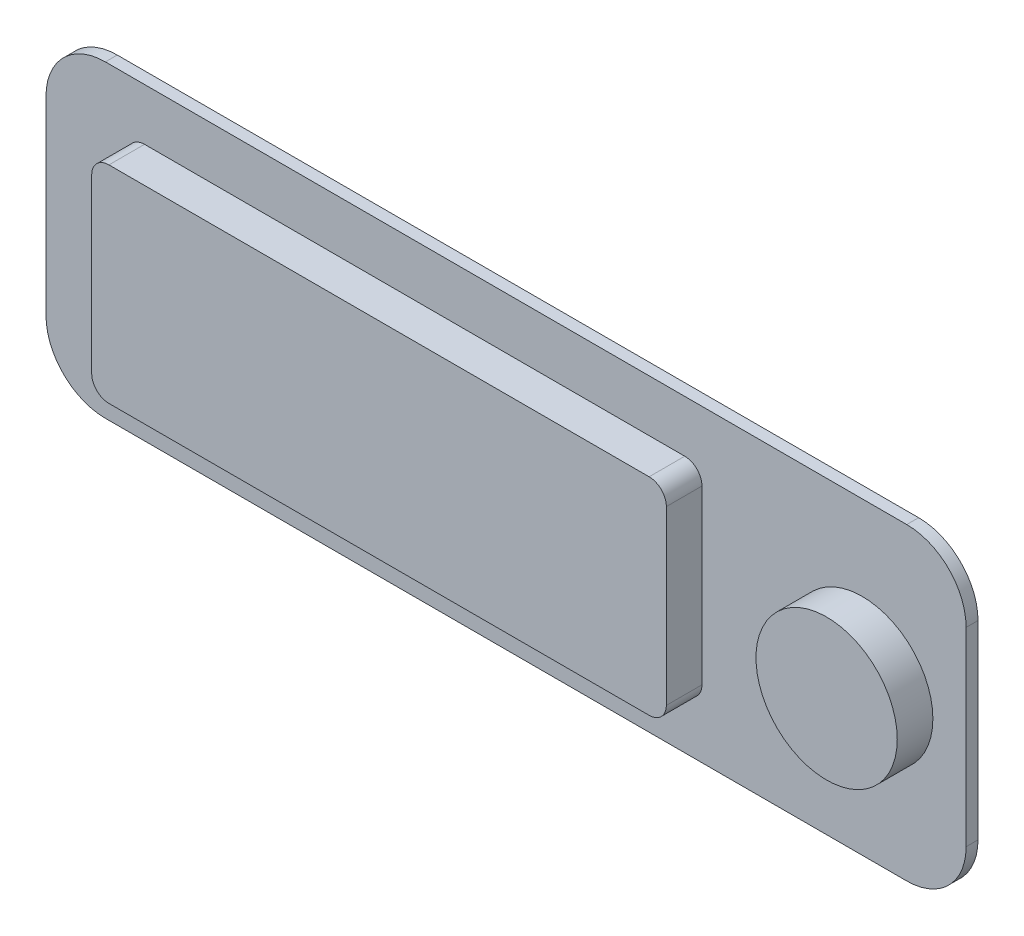
ISO-10303-21;
HEADER;
FILE_DESCRIPTION(('STEP AP214'),'2;1');
FILE_NAME('part.step','',(''),(''),'','','');
FILE_SCHEMA(('AUTOMOTIVE_DESIGN { 1 0 10303 214 1 1 1 1 }'));
ENDSEC;
DATA;
#1=APPLICATION_CONTEXT('core data for automotive mechanical design processes');
#2=APPLICATION_PROTOCOL_DEFINITION('international standard','automotive_design',2000,#1);
#3=PRODUCT_CONTEXT('',#1,'mechanical');
#4=PRODUCT('Part','Part','',(#3));
#5=PRODUCT_RELATED_PRODUCT_CATEGORY('part','',(#4));
#6=PRODUCT_DEFINITION_FORMATION('','',#4);
#7=PRODUCT_DEFINITION_CONTEXT('part definition',#1,'design');
#8=PRODUCT_DEFINITION('design','',#6,#7);
#9=PRODUCT_DEFINITION_SHAPE('','',#8);
#10=(LENGTH_UNIT() NAMED_UNIT(*) SI_UNIT(.MILLI.,.METRE.));
#11=(NAMED_UNIT(*) PLANE_ANGLE_UNIT() SI_UNIT($,.RADIAN.));
#12=(NAMED_UNIT(*) SI_UNIT($,.STERADIAN.) SOLID_ANGLE_UNIT());
#13=UNCERTAINTY_MEASURE_WITH_UNIT(LENGTH_MEASURE(1.E-05),#10,'distance_accuracy_value','');
#14=(GEOMETRIC_REPRESENTATION_CONTEXT(3) GLOBAL_UNCERTAINTY_ASSIGNED_CONTEXT((#13)) GLOBAL_UNIT_ASSIGNED_CONTEXT((#10,
#11,#12)) REPRESENTATION_CONTEXT('',''));
#15=CARTESIAN_POINT('',(0.,0.,0.));
#16=DIRECTION('',(0.,0.,1.));
#17=DIRECTION('',(1.,0.,0.));
#18=AXIS2_PLACEMENT_3D('',#15,#16,#17);
#19=CARTESIAN_POINT('',(0.,0.,2.));
#20=DIRECTION('',(0.,0.,1.));
#21=DIRECTION('',(1.,0.,0.));
#22=AXIS2_PLACEMENT_3D('',#19,#20,#21);
#23=PLANE('',#22);
#24=CARTESIAN_POINT('',(89.4228627528123,9.37536879548485,2.));
#25=DIRECTION('',(0.,0.,1.));
#26=DIRECTION('',(1.,0.,0.));
#27=AXIS2_PLACEMENT_3D('',#24,#25,#26);
#28=CIRCLE('',#27,11.9);
#29=CARTESIAN_POINT('',(101.322862752812,9.37536879548485,2.));
#30=VERTEX_POINT('',#29);
#31=EDGE_CURVE('E172',#30,#30,#28,.T.);
#32=ORIENTED_EDGE('',*,*,#31,.F.);
#33=EDGE_LOOP('',(#32));
#34=FACE_BOUND('',#33,.T.);
#35=DIRECTION('',(0.,-1.,0.));
#36=VECTOR('',#35,1.);
#37=CARTESIAN_POINT('',(-48.0771372471877,35.5051495016611,2.));
#38=LINE('',#37,#36);
#39=CARTESIAN_POINT('',(-48.0771372471877,25.5051495016611,2.));
#40=VERTEX_POINT('',#39);
#41=CARTESIAN_POINT('',(-48.0771372471877,-6.49485049833886,2.));
#42=VERTEX_POINT('',#41);
#43=EDGE_CURVE('E184',#40,#42,#38,.T.);
#44=ORIENTED_EDGE('',*,*,#43,.T.);
#45=CARTESIAN_POINT('',(-38.0771372471877,-6.49485049833887,2.));
#46=DIRECTION('',(0.,0.,1.));
#47=DIRECTION('',(1.,0.,0.));
#48=AXIS2_PLACEMENT_3D('',#45,#46,#47);
#49=CIRCLE('',#48,10.);
#50=CARTESIAN_POINT('',(-38.0771372471877,-16.4948504983389,2.));
#51=VERTEX_POINT('',#50);
#52=EDGE_CURVE('E229',#42,#51,#49,.T.);
#53=ORIENTED_EDGE('',*,*,#52,.T.);
#54=DIRECTION('',(1.,0.,0.));
#55=VECTOR('',#54,1.);
#56=CARTESIAN_POINT('',(-48.0771372471877,-16.4948504983389,2.));
#57=LINE('',#56,#55);
#58=CARTESIAN_POINT('',(96.9228627528123,-16.4948504983389,2.));
#59=VERTEX_POINT('',#58);
#60=EDGE_CURVE('E187',#51,#59,#57,.T.);
#61=ORIENTED_EDGE('',*,*,#60,.T.);
#62=CARTESIAN_POINT('',(96.9228627528123,-6.49485049833887,2.));
#63=DIRECTION('',(0.,0.,1.));
#64=DIRECTION('',(1.,0.,0.));
#65=AXIS2_PLACEMENT_3D('',#62,#63,#64);
#66=CIRCLE('',#65,10.);
#67=CARTESIAN_POINT('',(106.922862752812,-6.49485049833885,2.));
#68=VERTEX_POINT('',#67);
#69=EDGE_CURVE('E227',#59,#68,#66,.T.);
#70=ORIENTED_EDGE('',*,*,#69,.T.);
#71=DIRECTION('',(0.,1.,0.));
#72=VECTOR('',#71,1.);
#73=CARTESIAN_POINT('',(106.922862752812,35.5051495016611,2.));
#74=LINE('',#73,#72);
#75=CARTESIAN_POINT('',(106.922862752812,25.5051495016611,2.));
#76=VERTEX_POINT('',#75);
#77=EDGE_CURVE('E191',#68,#76,#74,.T.);
#78=ORIENTED_EDGE('',*,*,#77,.T.);
#79=CARTESIAN_POINT('',(96.9228627528123,25.5051495016611,2.));
#80=DIRECTION('',(0.,0.,1.));
#81=DIRECTION('',(1.,0.,0.));
#82=AXIS2_PLACEMENT_3D('',#79,#80,#81);
#83=CIRCLE('',#82,10.);
#84=CARTESIAN_POINT('',(96.9228627528123,35.5051495016611,2.));
#85=VERTEX_POINT('',#84);
#86=EDGE_CURVE('E225',#76,#85,#83,.T.);
#87=ORIENTED_EDGE('',*,*,#86,.T.);
#88=DIRECTION('',(-1.,0.,0.));
#89=VECTOR('',#88,1.);
#90=CARTESIAN_POINT('',(-48.0771372471877,35.5051495016611,2.));
#91=LINE('',#90,#89);
#92=CARTESIAN_POINT('',(-38.0771372471877,35.5051495016611,2.));
#93=VERTEX_POINT('',#92);
#94=EDGE_CURVE('E194',#85,#93,#91,.T.);
#95=ORIENTED_EDGE('',*,*,#94,.T.);
#96=CARTESIAN_POINT('',(-38.0771372471877,25.5051495016611,2.));
#97=DIRECTION('',(0.,0.,1.));
#98=DIRECTION('',(1.,0.,0.));
#99=AXIS2_PLACEMENT_3D('',#96,#97,#98);
#100=CIRCLE('',#99,10.);
#101=EDGE_CURVE('E223',#93,#40,#100,.T.);
#102=ORIENTED_EDGE('',*,*,#101,.T.);
#103=EDGE_LOOP('',(#44,#53,#61,#70,#78,#87,#95,#102));
#104=FACE_BOUND('',#103,.T.);
#105=DIRECTION('',(-1.,0.,0.));
#106=VECTOR('',#105,1.);
#107=CARTESIAN_POINT('',(-31.4771372471877,26.7753687954849,2.));
#108=LINE('',#107,#106);
#109=CARTESIAN_POINT('',(59.5228627528122,26.7753687954849,2.));
#110=VERTEX_POINT('',#109);
#111=CARTESIAN_POINT('',(-31.4771372471877,26.7753687954849,2.));
#112=VERTEX_POINT('',#111);
#113=EDGE_CURVE('E449',#110,#112,#108,.T.);
#114=ORIENTED_EDGE('',*,*,#113,.F.);
#115=CARTESIAN_POINT('',(59.5228627528123,23.8753687954849,2.));
#116=DIRECTION('',(0.,0.,1.));
#117=DIRECTION('',(-1.,0.,0.));
#118=AXIS2_PLACEMENT_3D('',#115,#116,#117);
#119=CIRCLE('',#118,2.9);
#120=CARTESIAN_POINT('',(62.4228627528123,23.8753687954848,2.));
#121=VERTEX_POINT('',#120);
#122=EDGE_CURVE('E170',#121,#110,#119,.T.);
#123=ORIENTED_EDGE('',*,*,#122,.F.);
#124=DIRECTION('',(0.,1.,0.));
#125=VECTOR('',#124,1.);
#126=CARTESIAN_POINT('',(62.4228627528123,-5.12463120451512,2.));
#127=LINE('',#126,#125);
#128=CARTESIAN_POINT('',(62.4228627528123,-5.12463120451512,2.));
#129=VERTEX_POINT('',#128);
#130=EDGE_CURVE('E166',#129,#121,#127,.T.);
#131=ORIENTED_EDGE('',*,*,#130,.F.);
#132=CARTESIAN_POINT('',(59.5228627528123,-5.12463120451515,2.));
#133=DIRECTION('',(0.,0.,1.));
#134=DIRECTION('',(1.,0.,0.));
#135=AXIS2_PLACEMENT_3D('',#132,#133,#134);
#136=CIRCLE('',#135,2.9);
#137=CARTESIAN_POINT('',(59.5228627528122,-8.02463120451515,2.));
#138=VERTEX_POINT('',#137);
#139=EDGE_CURVE('E445',#138,#129,#136,.T.);
#140=ORIENTED_EDGE('',*,*,#139,.F.);
#141=DIRECTION('',(1.,0.,0.));
#142=VECTOR('',#141,1.);
#143=CARTESIAN_POINT('',(-31.4771372471877,-8.02463120451515,2.));
#144=LINE('',#143,#142);
#145=CARTESIAN_POINT('',(-31.4771372471877,-8.02463120451515,2.));
#146=VERTEX_POINT('',#145);
#147=EDGE_CURVE('E461',#146,#138,#144,.T.);
#148=ORIENTED_EDGE('',*,*,#147,.F.);
#149=CARTESIAN_POINT('',(-31.4771372471877,-5.12463120451515,2.));
#150=DIRECTION('',(0.,0.,1.));
#151=DIRECTION('',(-1.,0.,0.));
#152=AXIS2_PLACEMENT_3D('',#149,#150,#151);
#153=CIRCLE('',#152,2.9);
#154=CARTESIAN_POINT('',(-34.3771372471877,-5.12463120451512,2.));
#155=VERTEX_POINT('',#154);
#156=EDGE_CURVE('E459',#155,#146,#153,.T.);
#157=ORIENTED_EDGE('',*,*,#156,.F.);
#158=DIRECTION('',(0.,-1.,0.));
#159=VECTOR('',#158,1.);
#160=CARTESIAN_POINT('',(-34.3771372471877,-5.12463120451512,2.));
#161=LINE('',#160,#159);
#162=CARTESIAN_POINT('',(-34.3771372471877,23.8753687954848,2.));
#163=VERTEX_POINT('',#162);
#164=EDGE_CURVE('E457',#163,#155,#161,.T.);
#165=ORIENTED_EDGE('',*,*,#164,.F.);
#166=CARTESIAN_POINT('',(-31.4771372471877,23.8753687954849,2.));
#167=DIRECTION('',(0.,0.,1.));
#168=DIRECTION('',(-1.,0.,0.));
#169=AXIS2_PLACEMENT_3D('',#166,#167,#168);
#170=CIRCLE('',#169,2.9);
#171=EDGE_CURVE('E451',#112,#163,#170,.T.);
#172=ORIENTED_EDGE('',*,*,#171,.F.);
#173=EDGE_LOOP('',(#114,#123,#131,#140,#148,#157,#165,#172));
#174=FACE_BOUND('',#173,.T.);
#175=ADVANCED_FACE('F33',(#34,#104,#174),#23,.T.);
#176=CARTESIAN_POINT('',(-48.0771372471877,35.5051495016611,2.));
#177=DIRECTION('',(1.,0.,0.));
#178=DIRECTION('',(0.,1.,0.));
#179=AXIS2_PLACEMENT_3D('',#176,#177,#178);
#180=PLANE('',#179);
#181=DIRECTION('',(0.,-1.,0.));
#182=VECTOR('',#181,1.);
#183=CARTESIAN_POINT('',(-48.0771372471877,35.5051495016611,0.));
#184=LINE('',#183,#182);
#185=CARTESIAN_POINT('',(-48.0771372471877,25.5051495016611,0.));
#186=VERTEX_POINT('',#185);
#187=CARTESIAN_POINT('',(-48.0771372471877,-6.49485049833886,0.));
#188=VERTEX_POINT('',#187);
#189=EDGE_CURVE('E182',#186,#188,#184,.T.);
#190=ORIENTED_EDGE('',*,*,#189,.T.);
#191=DIRECTION('',(0.,0.,-1.));
#192=VECTOR('',#191,1.);
#193=CARTESIAN_POINT('',(-48.0771372471877,-6.49485049833887,2.));
#194=LINE('',#193,#192);
#195=EDGE_CURVE('E221',#188,#42,#194,.F.);
#196=ORIENTED_EDGE('',*,*,#195,.T.);
#197=ORIENTED_EDGE('',*,*,#43,.F.);
#198=DIRECTION('',(0.,0.,-1.));
#199=VECTOR('',#198,1.);
#200=CARTESIAN_POINT('',(-48.0771372471877,25.5051495016611,2.));
#201=LINE('',#200,#199);
#202=EDGE_CURVE('E218',#40,#186,#201,.T.);
#203=ORIENTED_EDGE('',*,*,#202,.T.);
#204=EDGE_LOOP('',(#190,#196,#197,#203));
#205=FACE_BOUND('',#204,.T.);
#206=ADVANCED_FACE('F260',(#205),#180,.F.);
#207=CARTESIAN_POINT('',(-48.0771372471877,-16.4948504983389,2.));
#208=DIRECTION('',(0.,1.,0.));
#209=DIRECTION('',(0.,0.,1.));
#210=AXIS2_PLACEMENT_3D('',#207,#208,#209);
#211=PLANE('',#210);
#212=ORIENTED_EDGE('',*,*,#60,.F.);
#213=DIRECTION('',(0.,0.,-1.));
#214=VECTOR('',#213,1.);
#215=CARTESIAN_POINT('',(-38.0771372471877,-16.4948504983389,2.));
#216=LINE('',#215,#214);
#217=CARTESIAN_POINT('',(-38.0771372471877,-16.4948504983389,0.));
#218=VERTEX_POINT('',#217);
#219=EDGE_CURVE('E207',#51,#218,#216,.T.);
#220=ORIENTED_EDGE('',*,*,#219,.T.);
#221=DIRECTION('',(1.,0.,0.));
#222=VECTOR('',#221,1.);
#223=CARTESIAN_POINT('',(-48.0771372471877,-16.4948504983389,0.));
#224=LINE('',#223,#222);
#225=CARTESIAN_POINT('',(96.9228627528123,-16.4948504983389,0.));
#226=VERTEX_POINT('',#225);
#227=EDGE_CURVE('E199',#218,#226,#224,.T.);
#228=ORIENTED_EDGE('',*,*,#227,.T.);
#229=DIRECTION('',(0.,0.,-1.));
#230=VECTOR('',#229,1.);
#231=CARTESIAN_POINT('',(96.9228627528123,-16.4948504983389,2.));
#232=LINE('',#231,#230);
#233=EDGE_CURVE('E196',#226,#59,#232,.F.);
#234=ORIENTED_EDGE('',*,*,#233,.T.);
#235=EDGE_LOOP('',(#212,#220,#228,#234));
#236=FACE_BOUND('',#235,.T.);
#237=ADVANCED_FACE('F268',(#236),#211,.F.);
#238=CARTESIAN_POINT('',(106.922862752812,35.5051495016611,2.));
#239=DIRECTION('',(-1.,0.,0.));
#240=DIRECTION('',(0.,0.,1.));
#241=AXIS2_PLACEMENT_3D('',#238,#239,#240);
#242=PLANE('',#241);
#243=ORIENTED_EDGE('',*,*,#77,.F.);
#244=DIRECTION('',(0.,0.,-1.));
#245=VECTOR('',#244,1.);
#246=CARTESIAN_POINT('',(106.922862752812,-6.49485049833887,2.));
#247=LINE('',#246,#245);
#248=CARTESIAN_POINT('',(106.922862752812,-6.49485049833885,0.));
#249=VERTEX_POINT('',#248);
#250=EDGE_CURVE('E233',#68,#249,#247,.T.);
#251=ORIENTED_EDGE('',*,*,#250,.T.);
#252=DIRECTION('',(0.,1.,0.));
#253=VECTOR('',#252,1.);
#254=CARTESIAN_POINT('',(106.922862752812,35.5051495016611,0.));
#255=LINE('',#254,#253);
#256=CARTESIAN_POINT('',(106.922862752812,25.5051495016611,0.));
#257=VERTEX_POINT('',#256);
#258=EDGE_CURVE('E202',#249,#257,#255,.T.);
#259=ORIENTED_EDGE('',*,*,#258,.T.);
#260=DIRECTION('',(0.,0.,-1.));
#261=VECTOR('',#260,1.);
#262=CARTESIAN_POINT('',(106.922862752812,25.5051495016611,2.));
#263=LINE('',#262,#261);
#264=EDGE_CURVE('E231',#257,#76,#263,.F.);
#265=ORIENTED_EDGE('',*,*,#264,.T.);
#266=EDGE_LOOP('',(#243,#251,#259,#265));
#267=FACE_BOUND('',#266,.T.);
#268=ADVANCED_FACE('F239',(#267),#242,.F.);
#269=CARTESIAN_POINT('',(-48.0771372471877,35.5051495016611,2.));
#270=DIRECTION('',(0.,-1.,0.));
#271=DIRECTION('',(0.,0.,-1.));
#272=AXIS2_PLACEMENT_3D('',#269,#270,#271);
#273=PLANE('',#272);
#274=ORIENTED_EDGE('',*,*,#94,.F.);
#275=DIRECTION('',(0.,0.,-1.));
#276=VECTOR('',#275,1.);
#277=CARTESIAN_POINT('',(96.9228627528123,35.5051495016611,2.));
#278=LINE('',#277,#276);
#279=CARTESIAN_POINT('',(96.9228627528123,35.5051495016611,0.));
#280=VERTEX_POINT('',#279);
#281=EDGE_CURVE('E11',#85,#280,#278,.T.);
#282=ORIENTED_EDGE('',*,*,#281,.T.);
#283=DIRECTION('',(-1.,0.,0.));
#284=VECTOR('',#283,1.);
#285=CARTESIAN_POINT('',(-48.0771372471877,35.5051495016611,0.));
#286=LINE('',#285,#284);
#287=CARTESIAN_POINT('',(-38.0771372471877,35.5051495016611,0.));
#288=VERTEX_POINT('',#287);
#289=EDGE_CURVE('E188',#280,#288,#286,.T.);
#290=ORIENTED_EDGE('',*,*,#289,.T.);
#291=DIRECTION('',(0.,0.,-1.));
#292=VECTOR('',#291,1.);
#293=CARTESIAN_POINT('',(-38.0771372471877,35.5051495016611,2.));
#294=LINE('',#293,#292);
#295=EDGE_CURVE('E41',#288,#93,#294,.F.);
#296=ORIENTED_EDGE('',*,*,#295,.T.);
#297=EDGE_LOOP('',(#274,#282,#290,#296));
#298=FACE_BOUND('',#297,.T.);
#299=ADVANCED_FACE('F251',(#298),#273,.F.);
#300=CARTESIAN_POINT('',(0.,0.,0.));
#301=DIRECTION('',(0.,0.,1.));
#302=DIRECTION('',(1.,0.,0.));
#303=AXIS2_PLACEMENT_3D('',#300,#301,#302);
#304=PLANE('',#303);
#305=ORIENTED_EDGE('',*,*,#227,.F.);
#306=CARTESIAN_POINT('',(-38.0771372471877,-6.49485049833887,0.));
#307=DIRECTION('',(0.,0.,1.));
#308=DIRECTION('',(1.,0.,0.));
#309=AXIS2_PLACEMENT_3D('',#306,#307,#308);
#310=CIRCLE('',#309,10.);
#311=EDGE_CURVE('E216',#218,#188,#310,.F.);
#312=ORIENTED_EDGE('',*,*,#311,.T.);
#313=ORIENTED_EDGE('',*,*,#189,.F.);
#314=CARTESIAN_POINT('',(-38.0771372471877,25.5051495016611,0.));
#315=DIRECTION('',(0.,0.,1.));
#316=DIRECTION('',(1.,0.,0.));
#317=AXIS2_PLACEMENT_3D('',#314,#315,#316);
#318=CIRCLE('',#317,10.);
#319=EDGE_CURVE('E210',#186,#288,#318,.F.);
#320=ORIENTED_EDGE('',*,*,#319,.T.);
#321=ORIENTED_EDGE('',*,*,#289,.F.);
#322=CARTESIAN_POINT('',(96.9228627528123,25.5051495016611,0.));
#323=DIRECTION('',(0.,0.,1.));
#324=DIRECTION('',(1.,0.,0.));
#325=AXIS2_PLACEMENT_3D('',#322,#323,#324);
#326=CIRCLE('',#325,10.);
#327=EDGE_CURVE('E212',#280,#257,#326,.F.);
#328=ORIENTED_EDGE('',*,*,#327,.T.);
#329=ORIENTED_EDGE('',*,*,#258,.F.);
#330=CARTESIAN_POINT('',(96.9228627528123,-6.49485049833887,0.));
#331=DIRECTION('',(0.,0.,1.));
#332=DIRECTION('',(1.,0.,0.));
#333=AXIS2_PLACEMENT_3D('',#330,#331,#332);
#334=CIRCLE('',#333,10.);
#335=EDGE_CURVE('E214',#249,#226,#334,.F.);
#336=ORIENTED_EDGE('',*,*,#335,.T.);
#337=EDGE_LOOP('',(#305,#312,#313,#320,#321,#328,#329,#336));
#338=FACE_BOUND('',#337,.T.);
#339=ADVANCED_FACE('F245',(#338),#304,.F.);
#340=CARTESIAN_POINT('',(-38.0771372471877,-6.49485049833887,2.));
#341=DIRECTION('',(0.,0.,-1.));
#342=DIRECTION('',(-1.,0.,0.));
#343=AXIS2_PLACEMENT_3D('',#340,#341,#342);
#344=CYLINDRICAL_SURFACE('',#343,10.);
#345=ORIENTED_EDGE('',*,*,#52,.F.);
#346=ORIENTED_EDGE('',*,*,#195,.F.);
#347=ORIENTED_EDGE('',*,*,#311,.F.);
#348=ORIENTED_EDGE('',*,*,#219,.F.);
#349=EDGE_LOOP('',(#345,#346,#347,#348));
#350=FACE_BOUND('',#349,.T.);
#351=ADVANCED_FACE('F265',(#350),#344,.T.);
#352=CARTESIAN_POINT('',(96.9228627528123,-6.49485049833887,2.));
#353=DIRECTION('',(0.,0.,-1.));
#354=DIRECTION('',(-1.,0.,0.));
#355=AXIS2_PLACEMENT_3D('',#352,#353,#354);
#356=CYLINDRICAL_SURFACE('',#355,10.);
#357=ORIENTED_EDGE('',*,*,#69,.F.);
#358=ORIENTED_EDGE('',*,*,#233,.F.);
#359=ORIENTED_EDGE('',*,*,#335,.F.);
#360=ORIENTED_EDGE('',*,*,#250,.F.);
#361=EDGE_LOOP('',(#357,#358,#359,#360));
#362=FACE_BOUND('',#361,.T.);
#363=ADVANCED_FACE('F270',(#362),#356,.T.);
#364=CARTESIAN_POINT('',(96.9228627528123,25.5051495016611,2.));
#365=DIRECTION('',(0.,0.,-1.));
#366=DIRECTION('',(-1.,0.,0.));
#367=AXIS2_PLACEMENT_3D('',#364,#365,#366);
#368=CYLINDRICAL_SURFACE('',#367,10.);
#369=ORIENTED_EDGE('',*,*,#86,.F.);
#370=ORIENTED_EDGE('',*,*,#264,.F.);
#371=ORIENTED_EDGE('',*,*,#327,.F.);
#372=ORIENTED_EDGE('',*,*,#281,.F.);
#373=EDGE_LOOP('',(#369,#370,#371,#372));
#374=FACE_BOUND('',#373,.T.);
#375=ADVANCED_FACE('F250',(#374),#368,.T.);
#376=CARTESIAN_POINT('',(-38.0771372471877,25.5051495016611,2.));
#377=DIRECTION('',(0.,0.,-1.));
#378=DIRECTION('',(-1.,0.,0.));
#379=AXIS2_PLACEMENT_3D('',#376,#377,#378);
#380=CYLINDRICAL_SURFACE('',#379,10.);
#381=ORIENTED_EDGE('',*,*,#101,.F.);
#382=ORIENTED_EDGE('',*,*,#295,.F.);
#383=ORIENTED_EDGE('',*,*,#319,.F.);
#384=ORIENTED_EDGE('',*,*,#202,.F.);
#385=EDGE_LOOP('',(#381,#382,#383,#384));
#386=FACE_BOUND('',#385,.T.);
#387=ADVANCED_FACE('F35',(#386),#380,.T.);
#388=CARTESIAN_POINT('',(89.4228627528123,9.37536879548485,8.));
#389=DIRECTION('',(0.,0.,-1.));
#390=DIRECTION('',(-1.,0.,0.));
#391=AXIS2_PLACEMENT_3D('',#388,#389,#390);
#392=CYLINDRICAL_SURFACE('',#391,11.9);
#393=CARTESIAN_POINT('',(89.4228627528123,9.37536879548485,8.));
#394=DIRECTION('',(0.,0.,1.));
#395=DIRECTION('',(1.,0.,0.));
#396=AXIS2_PLACEMENT_3D('',#393,#394,#395);
#397=CIRCLE('',#396,11.9);
#398=CARTESIAN_POINT('',(101.322862752812,9.37536879548485,8.));
#399=VERTEX_POINT('',#398);
#400=EDGE_CURVE('E175',#399,#399,#397,.T.);
#401=ORIENTED_EDGE('',*,*,#400,.F.);
#402=EDGE_LOOP('',(#401));
#403=FACE_BOUND('',#402,.T.);
#404=ORIENTED_EDGE('',*,*,#31,.T.);
#405=EDGE_LOOP('',(#404));
#406=FACE_BOUND('',#405,.T.);
#407=ADVANCED_FACE('F288',(#403,#406),#392,.T.);
#408=CARTESIAN_POINT('',(89.4228627528123,9.37536879548485,8.));
#409=DIRECTION('',(0.,0.,1.));
#410=DIRECTION('',(1.,0.,0.));
#411=AXIS2_PLACEMENT_3D('',#408,#409,#410);
#412=PLANE('',#411);
#413=ORIENTED_EDGE('',*,*,#400,.T.);
#414=EDGE_LOOP('',(#413));
#415=FACE_BOUND('',#414,.T.);
#416=ADVANCED_FACE('F347',(#415),#412,.T.);
#417=CARTESIAN_POINT('',(59.5228627528123,23.8753687954849,8.));
#418=DIRECTION('',(0.,0.,-1.));
#419=DIRECTION('',(-1.,0.,0.));
#420=AXIS2_PLACEMENT_3D('',#417,#418,#419);
#421=CYLINDRICAL_SURFACE('',#420,2.9);
#422=ORIENTED_EDGE('',*,*,#122,.T.);
#423=DIRECTION('',(0.,0.,-1.));
#424=VECTOR('',#423,1.);
#425=CARTESIAN_POINT('',(59.5228627528122,26.7753687954849,8.));
#426=LINE('',#425,#424);
#427=CARTESIAN_POINT('',(59.5228627528122,26.7753687954849,8.));
#428=VERTEX_POINT('',#427);
#429=EDGE_CURVE('E151',#428,#110,#426,.T.);
#430=ORIENTED_EDGE('',*,*,#429,.F.);
#431=CARTESIAN_POINT('',(59.5228627528123,23.8753687954849,8.));
#432=DIRECTION('',(0.,0.,1.));
#433=DIRECTION('',(-1.,0.,0.));
#434=AXIS2_PLACEMENT_3D('',#431,#432,#433);
#435=CIRCLE('',#434,2.9);
#436=CARTESIAN_POINT('',(62.4228627528123,23.8753687954848,8.));
#437=VERTEX_POINT('',#436);
#438=EDGE_CURVE('E158',#437,#428,#435,.T.);
#439=ORIENTED_EDGE('',*,*,#438,.F.);
#440=DIRECTION('',(0.,0.,-1.));
#441=VECTOR('',#440,1.);
#442=CARTESIAN_POINT('',(62.4228627528123,23.8753687954848,8.));
#443=LINE('',#442,#441);
#444=EDGE_CURVE('E443',#437,#121,#443,.T.);
#445=ORIENTED_EDGE('',*,*,#444,.T.);
#446=EDGE_LOOP('',(#422,#430,#439,#445));
#447=FACE_BOUND('',#446,.T.);
#448=ADVANCED_FACE('F168',(#447),#421,.T.);
#449=CARTESIAN_POINT('',(-31.4771372471877,26.7753687954849,8.));
#450=DIRECTION('',(0.,-1.,0.));
#451=DIRECTION('',(0.,0.,-1.));
#452=AXIS2_PLACEMENT_3D('',#449,#450,#451);
#453=PLANE('',#452);
#454=ORIENTED_EDGE('',*,*,#113,.T.);
#455=DIRECTION('',(0.,0.,-1.));
#456=VECTOR('',#455,1.);
#457=CARTESIAN_POINT('',(-31.4771372471877,26.7753687954849,8.));
#458=LINE('',#457,#456);
#459=CARTESIAN_POINT('',(-31.4771372471877,26.7753687954849,8.));
#460=VERTEX_POINT('',#459);
#461=EDGE_CURVE('E154',#460,#112,#458,.T.);
#462=ORIENTED_EDGE('',*,*,#461,.F.);
#463=DIRECTION('',(-1.,0.,0.));
#464=VECTOR('',#463,1.);
#465=CARTESIAN_POINT('',(-31.4771372471877,26.7753687954849,8.));
#466=LINE('',#465,#464);
#467=EDGE_CURVE('E147',#428,#460,#466,.T.);
#468=ORIENTED_EDGE('',*,*,#467,.F.);
#469=ORIENTED_EDGE('',*,*,#429,.T.);
#470=EDGE_LOOP('',(#454,#462,#468,#469));
#471=FACE_BOUND('',#470,.T.);
#472=ADVANCED_FACE('F149',(#471),#453,.F.);
#473=CARTESIAN_POINT('',(-31.4771372471877,23.8753687954849,8.));
#474=DIRECTION('',(0.,0.,-1.));
#475=DIRECTION('',(-1.,0.,0.));
#476=AXIS2_PLACEMENT_3D('',#473,#474,#475);
#477=CYLINDRICAL_SURFACE('',#476,2.9);
#478=ORIENTED_EDGE('',*,*,#171,.T.);
#479=DIRECTION('',(0.,0.,-1.));
#480=VECTOR('',#479,1.);
#481=CARTESIAN_POINT('',(-34.3771372471877,23.8753687954848,8.));
#482=LINE('',#481,#480);
#483=CARTESIAN_POINT('',(-34.3771372471877,23.8753687954848,8.));
#484=VERTEX_POINT('',#483);
#485=EDGE_CURVE('E177',#484,#163,#482,.T.);
#486=ORIENTED_EDGE('',*,*,#485,.F.);
#487=CARTESIAN_POINT('',(-31.4771372471877,23.8753687954849,8.));
#488=DIRECTION('',(0.,0.,1.));
#489=DIRECTION('',(-1.,0.,0.));
#490=AXIS2_PLACEMENT_3D('',#487,#488,#489);
#491=CIRCLE('',#490,2.9);
#492=EDGE_CURVE('E157',#460,#484,#491,.T.);
#493=ORIENTED_EDGE('',*,*,#492,.F.);
#494=ORIENTED_EDGE('',*,*,#461,.T.);
#495=EDGE_LOOP('',(#478,#486,#493,#494));
#496=FACE_BOUND('',#495,.T.);
#497=ADVANCED_FACE('F372',(#496),#477,.T.);
#498=CARTESIAN_POINT('',(-34.3771372471877,-5.12463120451512,8.));
#499=DIRECTION('',(1.,0.,0.));
#500=DIRECTION('',(0.,0.,-1.));
#501=AXIS2_PLACEMENT_3D('',#498,#499,#500);
#502=PLANE('',#501);
#503=ORIENTED_EDGE('',*,*,#164,.T.);
#504=DIRECTION('',(0.,0.,-1.));
#505=VECTOR('',#504,1.);
#506=CARTESIAN_POINT('',(-34.3771372471877,-5.12463120451512,8.));
#507=LINE('',#506,#505);
#508=CARTESIAN_POINT('',(-34.3771372471877,-5.12463120451512,8.));
#509=VERTEX_POINT('',#508);
#510=EDGE_CURVE('E471',#509,#155,#507,.T.);
#511=ORIENTED_EDGE('',*,*,#510,.F.);
#512=DIRECTION('',(0.,-1.,0.));
#513=VECTOR('',#512,1.);
#514=CARTESIAN_POINT('',(-34.3771372471877,-5.12463120451512,8.));
#515=LINE('',#514,#513);
#516=EDGE_CURVE('E478',#484,#509,#515,.T.);
#517=ORIENTED_EDGE('',*,*,#516,.F.);
#518=ORIENTED_EDGE('',*,*,#485,.T.);
#519=EDGE_LOOP('',(#503,#511,#517,#518));
#520=FACE_BOUND('',#519,.T.);
#521=ADVANCED_FACE('F381',(#520),#502,.F.);
#522=CARTESIAN_POINT('',(-31.4771372471877,-5.12463120451515,8.));
#523=DIRECTION('',(0.,0.,-1.));
#524=DIRECTION('',(-1.,0.,0.));
#525=AXIS2_PLACEMENT_3D('',#522,#523,#524);
#526=CYLINDRICAL_SURFACE('',#525,2.9);
#527=ORIENTED_EDGE('',*,*,#156,.T.);
#528=DIRECTION('',(0.,0.,-1.));
#529=VECTOR('',#528,1.);
#530=CARTESIAN_POINT('',(-31.4771372471877,-8.02463120451515,8.));
#531=LINE('',#530,#529);
#532=CARTESIAN_POINT('',(-31.4771372471877,-8.02463120451515,8.));
#533=VERTEX_POINT('',#532);
#534=EDGE_CURVE('E468',#533,#146,#531,.T.);
#535=ORIENTED_EDGE('',*,*,#534,.F.);
#536=CARTESIAN_POINT('',(-31.4771372471877,-5.12463120451515,8.));
#537=DIRECTION('',(0.,0.,1.));
#538=DIRECTION('',(-1.,0.,0.));
#539=AXIS2_PLACEMENT_3D('',#536,#537,#538);
#540=CIRCLE('',#539,2.9);
#541=EDGE_CURVE('E488',#509,#533,#540,.T.);
#542=ORIENTED_EDGE('',*,*,#541,.F.);
#543=ORIENTED_EDGE('',*,*,#510,.T.);
#544=EDGE_LOOP('',(#527,#535,#542,#543));
#545=FACE_BOUND('',#544,.T.);
#546=ADVANCED_FACE('F391',(#545),#526,.T.);
#547=CARTESIAN_POINT('',(-31.4771372471877,-8.02463120451515,8.));
#548=DIRECTION('',(0.,1.,0.));
#549=DIRECTION('',(0.,0.,1.));
#550=AXIS2_PLACEMENT_3D('',#547,#548,#549);
#551=PLANE('',#550);
#552=ORIENTED_EDGE('',*,*,#147,.T.);
#553=DIRECTION('',(0.,0.,-1.));
#554=VECTOR('',#553,1.);
#555=CARTESIAN_POINT('',(59.5228627528122,-8.02463120451515,8.));
#556=LINE('',#555,#554);
#557=CARTESIAN_POINT('',(59.5228627528122,-8.02463120451515,8.));
#558=VERTEX_POINT('',#557);
#559=EDGE_CURVE('E465',#558,#138,#556,.T.);
#560=ORIENTED_EDGE('',*,*,#559,.F.);
#561=DIRECTION('',(1.,0.,0.));
#562=VECTOR('',#561,1.);
#563=CARTESIAN_POINT('',(-31.4771372471877,-8.02463120451515,8.));
#564=LINE('',#563,#562);
#565=EDGE_CURVE('E485',#533,#558,#564,.T.);
#566=ORIENTED_EDGE('',*,*,#565,.F.);
#567=ORIENTED_EDGE('',*,*,#534,.T.);
#568=EDGE_LOOP('',(#552,#560,#566,#567));
#569=FACE_BOUND('',#568,.T.);
#570=ADVANCED_FACE('F401',(#569),#551,.F.);
#571=CARTESIAN_POINT('',(59.5228627528123,-5.12463120451515,8.));
#572=DIRECTION('',(0.,0.,-1.));
#573=DIRECTION('',(-1.,0.,0.));
#574=AXIS2_PLACEMENT_3D('',#571,#572,#573);
#575=CYLINDRICAL_SURFACE('',#574,2.9);
#576=ORIENTED_EDGE('',*,*,#139,.T.);
#577=DIRECTION('',(0.,0.,-1.));
#578=VECTOR('',#577,1.);
#579=CARTESIAN_POINT('',(62.4228627528123,-5.12463120451512,8.));
#580=LINE('',#579,#578);
#581=CARTESIAN_POINT('',(62.4228627528123,-5.12463120451512,8.));
#582=VERTEX_POINT('',#581);
#583=EDGE_CURVE('E48',#582,#129,#580,.T.);
#584=ORIENTED_EDGE('',*,*,#583,.F.);
#585=CARTESIAN_POINT('',(59.5228627528123,-5.12463120451515,8.));
#586=DIRECTION('',(0.,0.,1.));
#587=DIRECTION('',(1.,0.,0.));
#588=AXIS2_PLACEMENT_3D('',#585,#586,#587);
#589=CIRCLE('',#588,2.9);
#590=EDGE_CURVE('E487',#558,#582,#589,.T.);
#591=ORIENTED_EDGE('',*,*,#590,.F.);
#592=ORIENTED_EDGE('',*,*,#559,.T.);
#593=EDGE_LOOP('',(#576,#584,#591,#592));
#594=FACE_BOUND('',#593,.T.);
#595=ADVANCED_FACE('F411',(#594),#575,.T.);
#596=CARTESIAN_POINT('',(62.4228627528123,-5.12463120451512,8.));
#597=DIRECTION('',(-1.,0.,0.));
#598=DIRECTION('',(0.,0.,1.));
#599=AXIS2_PLACEMENT_3D('',#596,#597,#598);
#600=PLANE('',#599);
#601=ORIENTED_EDGE('',*,*,#130,.T.);
#602=ORIENTED_EDGE('',*,*,#444,.F.);
#603=DIRECTION('',(0.,1.,0.));
#604=VECTOR('',#603,1.);
#605=CARTESIAN_POINT('',(62.4228627528123,-5.12463120451512,8.));
#606=LINE('',#605,#604);
#607=EDGE_CURVE('E162',#582,#437,#606,.T.);
#608=ORIENTED_EDGE('',*,*,#607,.F.);
#609=ORIENTED_EDGE('',*,*,#583,.T.);
#610=EDGE_LOOP('',(#601,#602,#608,#609));
#611=FACE_BOUND('',#610,.T.);
#612=ADVANCED_FACE('F421',(#611),#600,.F.);
#613=CARTESIAN_POINT('',(59.5228627528123,23.8753687954849,8.));
#614=DIRECTION('',(0.,0.,-1.));
#615=DIRECTION('',(-1.,0.,0.));
#616=AXIS2_PLACEMENT_3D('',#613,#614,#615);
#617=PLANE('',#616);
#618=ORIENTED_EDGE('',*,*,#438,.T.);
#619=ORIENTED_EDGE('',*,*,#467,.T.);
#620=ORIENTED_EDGE('',*,*,#492,.T.);
#621=ORIENTED_EDGE('',*,*,#516,.T.);
#622=ORIENTED_EDGE('',*,*,#541,.T.);
#623=ORIENTED_EDGE('',*,*,#565,.T.);
#624=ORIENTED_EDGE('',*,*,#590,.T.);
#625=ORIENTED_EDGE('',*,*,#607,.T.);
#626=EDGE_LOOP('',(#618,#619,#620,#621,#622,#623,#624,#625));
#627=FACE_BOUND('',#626,.T.);
#628=ADVANCED_FACE('F161',(#627),#617,.F.);
#629=CLOSED_SHELL('',(#175,#206,#237,#268,#299,#339,#351,#363,#375,#387,#407,#416,#448,#472,
#497,#521,#546,#570,#595,#612,#628));
#630=MANIFOLD_SOLID_BREP('B2',#629);
#631=ADVANCED_BREP_SHAPE_REPRESENTATION('',(#18,#630),#14);
#632=SHAPE_DEFINITION_REPRESENTATION(#9,#631);
ENDSEC;
END-ISO-10303-21;
